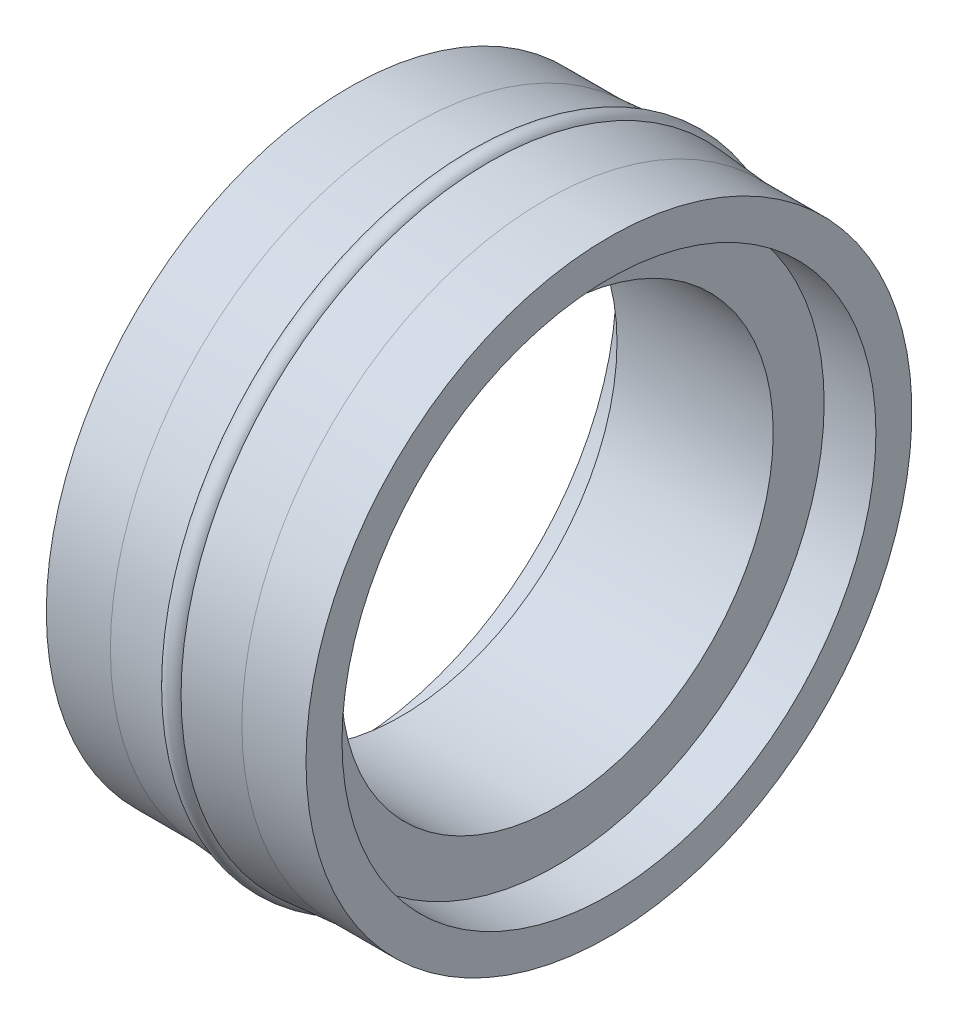
ISO-10303-21;
HEADER;
FILE_DESCRIPTION(('STEP AP214'),'2;1');
FILE_NAME('part.step','',(''),(''),'','','');
FILE_SCHEMA(('AUTOMOTIVE_DESIGN { 1 0 10303 214 1 1 1 1 }'));
ENDSEC;
DATA;
#1=APPLICATION_CONTEXT('core data for automotive mechanical design processes');
#2=APPLICATION_PROTOCOL_DEFINITION('international standard','automotive_design',2000,#1);
#3=PRODUCT_CONTEXT('',#1,'mechanical');
#4=PRODUCT('Part','Part','',(#3));
#5=PRODUCT_RELATED_PRODUCT_CATEGORY('part','',(#4));
#6=PRODUCT_DEFINITION_FORMATION('','',#4);
#7=PRODUCT_DEFINITION_CONTEXT('part definition',#1,'design');
#8=PRODUCT_DEFINITION('design','',#6,#7);
#9=PRODUCT_DEFINITION_SHAPE('','',#8);
#10=(LENGTH_UNIT() NAMED_UNIT(*) SI_UNIT(.MILLI.,.METRE.));
#11=(NAMED_UNIT(*) PLANE_ANGLE_UNIT() SI_UNIT($,.RADIAN.));
#12=(NAMED_UNIT(*) SI_UNIT($,.STERADIAN.) SOLID_ANGLE_UNIT());
#13=UNCERTAINTY_MEASURE_WITH_UNIT(LENGTH_MEASURE(1.E-05),#10,'distance_accuracy_value','');
#14=(GEOMETRIC_REPRESENTATION_CONTEXT(3) GLOBAL_UNCERTAINTY_ASSIGNED_CONTEXT((#13)) GLOBAL_UNIT_ASSIGNED_CONTEXT((#10,
#11,#12)) REPRESENTATION_CONTEXT('',''));
#15=CARTESIAN_POINT('',(0.,0.,0.));
#16=DIRECTION('',(0.,0.,1.));
#17=DIRECTION('',(1.,0.,0.));
#18=AXIS2_PLACEMENT_3D('',#15,#16,#17);
#19=CARTESIAN_POINT('',(21.7278815667835,0.,0.));
#20=DIRECTION('',(1.,0.,0.));
#21=DIRECTION('',(0.,0.,-1.));
#22=AXIS2_PLACEMENT_3D('',#19,#20,#21);
#23=CONICAL_SURFACE('',#22,24.8750379105564,0.0823310950473808);
#24=CARTESIAN_POINT('',(17.1829384884065,0.,0.));
#25=DIRECTION('',(-1.,0.,0.));
#26=DIRECTION('',(0.,0.,1.));
#27=AXIS2_PLACEMENT_3D('',#24,#25,#26);
#28=CIRCLE('',#27,24.5);
#29=CARTESIAN_POINT('',(17.1829384884065,0.,24.5));
#30=VERTEX_POINT('',#29);
#31=EDGE_CURVE('E72',#30,#30,#28,.T.);
#32=ORIENTED_EDGE('',*,*,#31,.F.);
#33=EDGE_LOOP('',(#32));
#34=FACE_BOUND('',#33,.T.);
#35=CARTESIAN_POINT('',(21.7278815667835,0.,0.));
#36=DIRECTION('',(-1.,0.,0.));
#37=DIRECTION('',(0.,0.,1.));
#38=AXIS2_PLACEMENT_3D('',#35,#36,#37);
#39=CIRCLE('',#38,24.8750379105564);
#40=CARTESIAN_POINT('',(21.7278815667835,0.,24.8750379105564));
#41=VERTEX_POINT('',#40);
#42=EDGE_CURVE('E10',#41,#41,#39,.T.);
#43=ORIENTED_EDGE('',*,*,#42,.T.);
#44=EDGE_LOOP('',(#43));
#45=FACE_BOUND('',#44,.T.);
#46=ADVANCED_FACE('F32',(#34,#45),#23,.T.);
#47=CARTESIAN_POINT('',(22.5,0.,0.));
#48=DIRECTION('',(-1.,0.,0.));
#49=DIRECTION('',(0.,0.,1.));
#50=AXIS2_PLACEMENT_3D('',#47,#48,#49);
#51=TOROIDAL_SURFACE('',#50,24.3848558764812,0.914573835971049);
#52=ORIENTED_EDGE('',*,*,#42,.F.);
#53=EDGE_LOOP('',(#52));
#54=FACE_BOUND('',#53,.T.);
#55=CARTESIAN_POINT('',(23.2721184332165,0.,0.));
#56=DIRECTION('',(-1.,0.,0.));
#57=DIRECTION('',(0.,0.,1.));
#58=AXIS2_PLACEMENT_3D('',#55,#56,#57);
#59=CIRCLE('',#58,24.8750379105564);
#60=CARTESIAN_POINT('',(23.2721184332165,0.,24.8750379105564));
#61=VERTEX_POINT('',#60);
#62=EDGE_CURVE('E38',#61,#61,#59,.T.);
#63=ORIENTED_EDGE('',*,*,#62,.T.);
#64=EDGE_LOOP('',(#63));
#65=FACE_BOUND('',#64,.T.);
#66=ADVANCED_FACE('F79',(#54,#65),#51,.T.);
#67=CARTESIAN_POINT('',(27.8170615115935,0.,0.));
#68=DIRECTION('',(-1.,0.,0.));
#69=DIRECTION('',(0.,0.,1.));
#70=AXIS2_PLACEMENT_3D('',#67,#68,#69);
#71=CONICAL_SURFACE('',#70,24.5,0.0823310950473837);
#72=ORIENTED_EDGE('',*,*,#62,.F.);
#73=EDGE_LOOP('',(#72));
#74=FACE_BOUND('',#73,.T.);
#75=CARTESIAN_POINT('',(27.8170615115935,0.,0.));
#76=DIRECTION('',(-1.,0.,0.));
#77=DIRECTION('',(0.,0.,1.));
#78=AXIS2_PLACEMENT_3D('',#75,#76,#77);
#79=CIRCLE('',#78,24.5);
#80=CARTESIAN_POINT('',(27.8170615115935,0.,24.5));
#81=VERTEX_POINT('',#80);
#82=EDGE_CURVE('E42',#81,#81,#79,.T.);
#83=ORIENTED_EDGE('',*,*,#82,.T.);
#84=EDGE_LOOP('',(#83));
#85=FACE_BOUND('',#84,.T.);
#86=ADVANCED_FACE('F83',(#74,#85),#71,.T.);
#87=CARTESIAN_POINT('',(0.,0.,0.));
#88=DIRECTION('',(-1.,0.,0.));
#89=DIRECTION('',(0.,0.,1.));
#90=AXIS2_PLACEMENT_3D('',#87,#88,#89);
#91=CYLINDRICAL_SURFACE('',#90,24.5);
#92=ORIENTED_EDGE('',*,*,#82,.F.);
#93=EDGE_LOOP('',(#92));
#94=FACE_BOUND('',#93,.T.);
#95=CARTESIAN_POINT('',(33.0018563562462,0.,0.));
#96=DIRECTION('',(-1.,0.,0.));
#97=DIRECTION('',(0.,0.,1.));
#98=AXIS2_PLACEMENT_3D('',#95,#96,#97);
#99=CIRCLE('',#98,24.5);
#100=CARTESIAN_POINT('',(33.0018563562462,0.,24.5));
#101=VERTEX_POINT('',#100);
#102=EDGE_CURVE('E46',#101,#101,#99,.T.);
#103=ORIENTED_EDGE('',*,*,#102,.T.);
#104=EDGE_LOOP('',(#103));
#105=FACE_BOUND('',#104,.T.);
#106=ADVANCED_FACE('F88',(#94,#105),#91,.T.);
#107=CARTESIAN_POINT('',(33.0018563562462,21.5912270213506,0.));
#108=DIRECTION('',(-1.,0.,0.));
#109=DIRECTION('',(0.,0.,1.));
#110=AXIS2_PLACEMENT_3D('',#107,#108,#109);
#111=PLANE('',#110);
#112=ORIENTED_EDGE('',*,*,#102,.F.);
#113=EDGE_LOOP('',(#112));
#114=FACE_BOUND('',#113,.T.);
#115=CARTESIAN_POINT('',(33.0018563562462,0.,0.));
#116=DIRECTION('',(-1.,0.,0.));
#117=DIRECTION('',(0.,0.,1.));
#118=AXIS2_PLACEMENT_3D('',#115,#116,#117);
#119=CIRCLE('',#118,21.5912270213506);
#120=CARTESIAN_POINT('',(33.0018563562462,0.,21.5912270213506));
#121=VERTEX_POINT('',#120);
#122=EDGE_CURVE('E51',#121,#121,#119,.T.);
#123=ORIENTED_EDGE('',*,*,#122,.T.);
#124=EDGE_LOOP('',(#123));
#125=FACE_BOUND('',#124,.T.);
#126=ADVANCED_FACE('F94',(#114,#125),#111,.F.);
#127=CARTESIAN_POINT('',(0.,0.,0.));
#128=DIRECTION('',(-1.,0.,0.));
#129=DIRECTION('',(0.,0.,1.));
#130=AXIS2_PLACEMENT_3D('',#127,#128,#129);
#131=CYLINDRICAL_SURFACE('',#130,21.5912270213506);
#132=ORIENTED_EDGE('',*,*,#122,.F.);
#133=EDGE_LOOP('',(#132));
#134=FACE_BOUND('',#133,.T.);
#135=CARTESIAN_POINT('',(28.8170615115935,0.,0.));
#136=DIRECTION('',(-1.,0.,0.));
#137=DIRECTION('',(0.,0.,1.));
#138=AXIS2_PLACEMENT_3D('',#135,#136,#137);
#139=CIRCLE('',#138,21.5912270213506);
#140=CARTESIAN_POINT('',(28.8170615115935,0.,21.5912270213506));
#141=VERTEX_POINT('',#140);
#142=EDGE_CURVE('E54',#141,#141,#139,.T.);
#143=ORIENTED_EDGE('',*,*,#142,.T.);
#144=EDGE_LOOP('',(#143));
#145=FACE_BOUND('',#144,.T.);
#146=ADVANCED_FACE('F98',(#134,#145),#131,.F.);
#147=CARTESIAN_POINT('',(28.8170615115935,17.4719727164338,0.));
#148=DIRECTION('',(-1.,0.,0.));
#149=DIRECTION('',(0.,0.,1.));
#150=AXIS2_PLACEMENT_3D('',#147,#148,#149);
#151=PLANE('',#150);
#152=ORIENTED_EDGE('',*,*,#142,.F.);
#153=EDGE_LOOP('',(#152));
#154=FACE_BOUND('',#153,.T.);
#155=CARTESIAN_POINT('',(28.8170615115935,0.,0.));
#156=DIRECTION('',(-1.,0.,0.));
#157=DIRECTION('',(0.,0.,1.));
#158=AXIS2_PLACEMENT_3D('',#155,#156,#157);
#159=CIRCLE('',#158,17.4719727164338);
#160=CARTESIAN_POINT('',(28.8170615115935,0.,17.4719727164338));
#161=VERTEX_POINT('',#160);
#162=EDGE_CURVE('E57',#161,#161,#159,.T.);
#163=ORIENTED_EDGE('',*,*,#162,.T.);
#164=EDGE_LOOP('',(#163));
#165=FACE_BOUND('',#164,.T.);
#166=ADVANCED_FACE('F102',(#154,#165),#151,.F.);
#167=CARTESIAN_POINT('',(0.,0.,0.));
#168=DIRECTION('',(-1.,0.,0.));
#169=DIRECTION('',(0.,0.,1.));
#170=AXIS2_PLACEMENT_3D('',#167,#168,#169);
#171=CYLINDRICAL_SURFACE('',#170,17.4719727164338);
#172=ORIENTED_EDGE('',*,*,#162,.F.);
#173=EDGE_LOOP('',(#172));
#174=FACE_BOUND('',#173,.T.);
#175=CARTESIAN_POINT('',(16.1829384884065,0.,0.));
#176=DIRECTION('',(-1.,0.,0.));
#177=DIRECTION('',(0.,0.,1.));
#178=AXIS2_PLACEMENT_3D('',#175,#176,#177);
#179=CIRCLE('',#178,17.4719727164338);
#180=CARTESIAN_POINT('',(16.1829384884065,0.,17.4719727164338));
#181=VERTEX_POINT('',#180);
#182=EDGE_CURVE('E60',#181,#181,#179,.T.);
#183=ORIENTED_EDGE('',*,*,#182,.T.);
#184=EDGE_LOOP('',(#183));
#185=FACE_BOUND('',#184,.T.);
#186=ADVANCED_FACE('F106',(#174,#185),#171,.F.);
#187=CARTESIAN_POINT('',(16.1829384884065,21.5912270213506,0.));
#188=DIRECTION('',(1.,0.,0.));
#189=DIRECTION('',(0.,0.,-1.));
#190=AXIS2_PLACEMENT_3D('',#187,#188,#189);
#191=PLANE('',#190);
#192=ORIENTED_EDGE('',*,*,#182,.F.);
#193=EDGE_LOOP('',(#192));
#194=FACE_BOUND('',#193,.T.);
#195=CARTESIAN_POINT('',(16.1829384884065,0.,0.));
#196=DIRECTION('',(-1.,0.,0.));
#197=DIRECTION('',(0.,0.,1.));
#198=AXIS2_PLACEMENT_3D('',#195,#196,#197);
#199=CIRCLE('',#198,21.5912270213506);
#200=CARTESIAN_POINT('',(16.1829384884065,0.,21.5912270213506));
#201=VERTEX_POINT('',#200);
#202=EDGE_CURVE('E63',#201,#201,#199,.T.);
#203=ORIENTED_EDGE('',*,*,#202,.T.);
#204=EDGE_LOOP('',(#203));
#205=FACE_BOUND('',#204,.T.);
#206=ADVANCED_FACE('F110',(#194,#205),#191,.F.);
#207=CARTESIAN_POINT('',(0.,0.,0.));
#208=DIRECTION('',(-1.,0.,0.));
#209=DIRECTION('',(0.,0.,1.));
#210=AXIS2_PLACEMENT_3D('',#207,#208,#209);
#211=CYLINDRICAL_SURFACE('',#210,21.5912270213506);
#212=ORIENTED_EDGE('',*,*,#202,.F.);
#213=EDGE_LOOP('',(#212));
#214=FACE_BOUND('',#213,.T.);
#215=CARTESIAN_POINT('',(12.,0.,0.));
#216=DIRECTION('',(-1.,0.,0.));
#217=DIRECTION('',(0.,0.,1.));
#218=AXIS2_PLACEMENT_3D('',#215,#216,#217);
#219=CIRCLE('',#218,21.5912270213506);
#220=CARTESIAN_POINT('',(12.,0.,21.5912270213506));
#221=VERTEX_POINT('',#220);
#222=EDGE_CURVE('E66',#221,#221,#219,.T.);
#223=ORIENTED_EDGE('',*,*,#222,.T.);
#224=EDGE_LOOP('',(#223));
#225=FACE_BOUND('',#224,.T.);
#226=ADVANCED_FACE('F114',(#214,#225),#211,.F.);
#227=CARTESIAN_POINT('',(12.,24.5,0.));
#228=DIRECTION('',(1.,0.,0.));
#229=DIRECTION('',(0.,0.,-1.));
#230=AXIS2_PLACEMENT_3D('',#227,#228,#229);
#231=PLANE('',#230);
#232=ORIENTED_EDGE('',*,*,#222,.F.);
#233=EDGE_LOOP('',(#232));
#234=FACE_BOUND('',#233,.T.);
#235=CARTESIAN_POINT('',(12.,0.,0.));
#236=DIRECTION('',(-1.,0.,0.));
#237=DIRECTION('',(0.,0.,1.));
#238=AXIS2_PLACEMENT_3D('',#235,#236,#237);
#239=CIRCLE('',#238,24.5);
#240=CARTESIAN_POINT('',(12.,0.,24.5));
#241=VERTEX_POINT('',#240);
#242=EDGE_CURVE('E69',#241,#241,#239,.T.);
#243=ORIENTED_EDGE('',*,*,#242,.T.);
#244=EDGE_LOOP('',(#243));
#245=FACE_BOUND('',#244,.T.);
#246=ADVANCED_FACE('F118',(#234,#245),#231,.F.);
#247=CARTESIAN_POINT('',(0.,0.,0.));
#248=DIRECTION('',(-1.,0.,0.));
#249=DIRECTION('',(0.,0.,1.));
#250=AXIS2_PLACEMENT_3D('',#247,#248,#249);
#251=CYLINDRICAL_SURFACE('',#250,24.5);
#252=ORIENTED_EDGE('',*,*,#242,.F.);
#253=EDGE_LOOP('',(#252));
#254=FACE_BOUND('',#253,.T.);
#255=ORIENTED_EDGE('',*,*,#31,.T.);
#256=EDGE_LOOP('',(#255));
#257=FACE_BOUND('',#256,.T.);
#258=ADVANCED_FACE('F76',(#254,#257),#251,.T.);
#259=CLOSED_SHELL('',(#46,#66,#86,#106,#126,#146,#166,#186,#206,#226,#246,#258));
#260=MANIFOLD_SOLID_BREP('B2',#259);
#261=ADVANCED_BREP_SHAPE_REPRESENTATION('',(#18,#260),#14);
#262=SHAPE_DEFINITION_REPRESENTATION(#9,#261);
ENDSEC;
END-ISO-10303-21;
